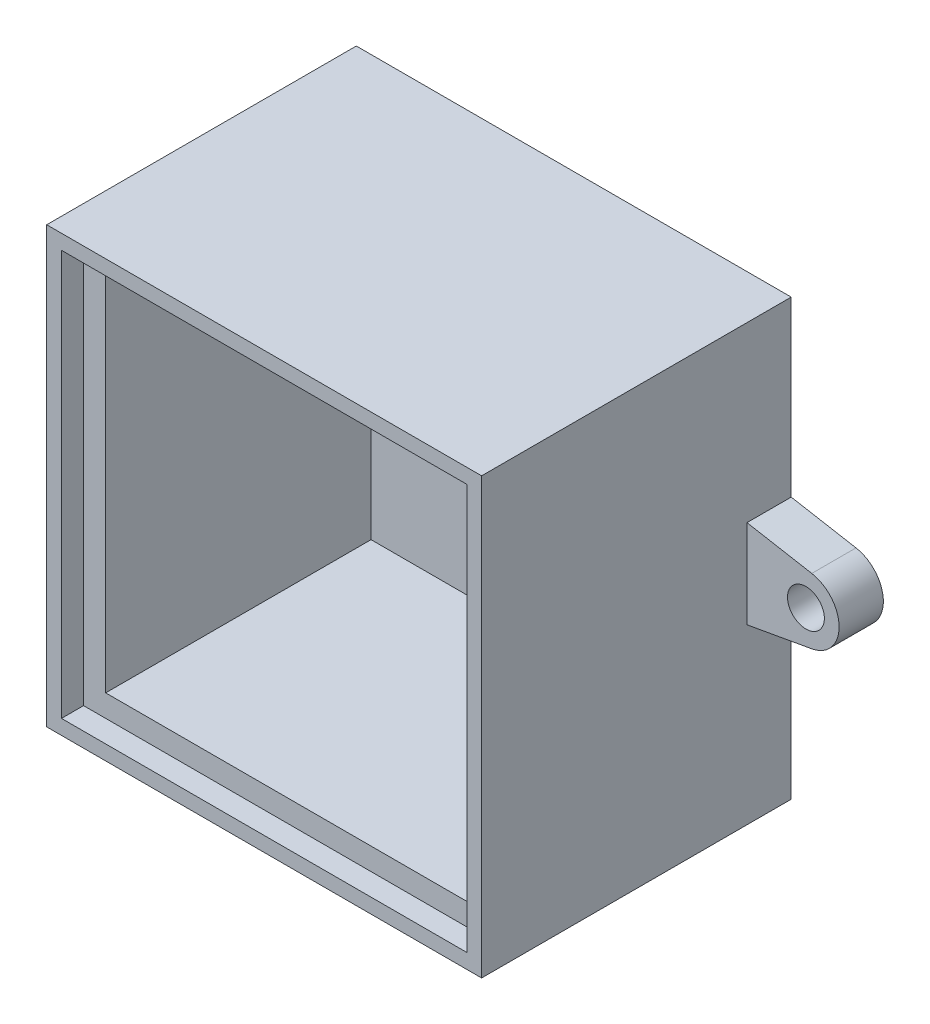
ISO-10303-21;
HEADER;
FILE_DESCRIPTION(('STEP AP214'),'2;1');
FILE_NAME('part.step','',(''),(''),'','','');
FILE_SCHEMA(('AUTOMOTIVE_DESIGN { 1 0 10303 214 1 1 1 1 }'));
ENDSEC;
DATA;
#1=APPLICATION_CONTEXT('core data for automotive mechanical design processes');
#2=APPLICATION_PROTOCOL_DEFINITION('international standard','automotive_design',2000,#1);
#3=PRODUCT_CONTEXT('',#1,'mechanical');
#4=PRODUCT('Part','Part','',(#3));
#5=PRODUCT_RELATED_PRODUCT_CATEGORY('part','',(#4));
#6=PRODUCT_DEFINITION_FORMATION('','',#4);
#7=PRODUCT_DEFINITION_CONTEXT('part definition',#1,'design');
#8=PRODUCT_DEFINITION('design','',#6,#7);
#9=PRODUCT_DEFINITION_SHAPE('','',#8);
#10=(LENGTH_UNIT() NAMED_UNIT(*) SI_UNIT(.MILLI.,.METRE.));
#11=(NAMED_UNIT(*) PLANE_ANGLE_UNIT() SI_UNIT($,.RADIAN.));
#12=(NAMED_UNIT(*) SI_UNIT($,.STERADIAN.) SOLID_ANGLE_UNIT());
#13=UNCERTAINTY_MEASURE_WITH_UNIT(LENGTH_MEASURE(1.E-05),#10,'distance_accuracy_value','');
#14=(GEOMETRIC_REPRESENTATION_CONTEXT(3) GLOBAL_UNCERTAINTY_ASSIGNED_CONTEXT((#13)) GLOBAL_UNIT_ASSIGNED_CONTEXT((#10,
#11,#12)) REPRESENTATION_CONTEXT('',''));
#15=CARTESIAN_POINT('',(0.,0.,0.));
#16=DIRECTION('',(0.,0.,1.));
#17=DIRECTION('',(1.,0.,0.));
#18=AXIS2_PLACEMENT_3D('',#15,#16,#17);
#19=CARTESIAN_POINT('',(0.,0.,36.));
#20=DIRECTION('',(0.,0.,1.));
#21=DIRECTION('',(1.,0.,0.));
#22=AXIS2_PLACEMENT_3D('',#19,#20,#21);
#23=PLANE('',#22);
#24=DIRECTION('',(0.,-1.,0.));
#25=VECTOR('',#24,1.);
#26=CARTESIAN_POINT('',(-27.5,-27.5,36.));
#27=LINE('',#26,#25);
#28=CARTESIAN_POINT('',(-27.5,27.5,36.));
#29=VERTEX_POINT('',#28);
#30=CARTESIAN_POINT('',(-27.5,-27.5,36.));
#31=VERTEX_POINT('',#30);
#32=EDGE_CURVE('E327',#29,#31,#27,.T.);
#33=ORIENTED_EDGE('',*,*,#32,.T.);
#34=DIRECTION('',(1.,0.,0.));
#35=VECTOR('',#34,1.);
#36=CARTESIAN_POINT('',(27.5,-27.5,36.));
#37=LINE('',#36,#35);
#38=CARTESIAN_POINT('',(27.5,-27.5,36.));
#39=VERTEX_POINT('',#38);
#40=EDGE_CURVE('E340',#31,#39,#37,.T.);
#41=ORIENTED_EDGE('',*,*,#40,.T.);
#42=DIRECTION('',(0.,1.,0.));
#43=VECTOR('',#42,1.);
#44=CARTESIAN_POINT('',(27.5,-27.5,36.));
#45=LINE('',#44,#43);
#46=CARTESIAN_POINT('',(27.5,27.5,36.));
#47=VERTEX_POINT('',#46);
#48=EDGE_CURVE('E342',#39,#47,#45,.T.);
#49=ORIENTED_EDGE('',*,*,#48,.T.);
#50=DIRECTION('',(-1.,0.,0.));
#51=VECTOR('',#50,1.);
#52=CARTESIAN_POINT('',(27.5,27.5,36.));
#53=LINE('',#52,#51);
#54=EDGE_CURVE('E331',#47,#29,#53,.T.);
#55=ORIENTED_EDGE('',*,*,#54,.T.);
#56=EDGE_LOOP('',(#33,#41,#49,#55));
#57=FACE_BOUND('',#56,.T.);
#58=DIRECTION('',(1.,0.,0.));
#59=VECTOR('',#58,1.);
#60=CARTESIAN_POINT('',(24.5,-24.5,36.));
#61=LINE('',#60,#59);
#62=CARTESIAN_POINT('',(-24.5,-24.5,36.));
#63=VERTEX_POINT('',#62);
#64=CARTESIAN_POINT('',(24.5,-24.5,36.));
#65=VERTEX_POINT('',#64);
#66=EDGE_CURVE('E371',#63,#65,#61,.T.);
#67=ORIENTED_EDGE('',*,*,#66,.F.);
#68=DIRECTION('',(0.,-1.,0.));
#69=VECTOR('',#68,1.);
#70=CARTESIAN_POINT('',(-24.5,-24.5,36.));
#71=LINE('',#70,#69);
#72=CARTESIAN_POINT('',(-24.5,24.5,36.));
#73=VERTEX_POINT('',#72);
#74=EDGE_CURVE('E369',#73,#63,#71,.T.);
#75=ORIENTED_EDGE('',*,*,#74,.F.);
#76=DIRECTION('',(-1.,0.,0.));
#77=VECTOR('',#76,1.);
#78=CARTESIAN_POINT('',(24.5,24.5,36.));
#79=LINE('',#78,#77);
#80=CARTESIAN_POINT('',(24.5,24.5,36.));
#81=VERTEX_POINT('',#80);
#82=EDGE_CURVE('E377',#81,#73,#79,.T.);
#83=ORIENTED_EDGE('',*,*,#82,.F.);
#84=DIRECTION('',(0.,1.,0.));
#85=VECTOR('',#84,1.);
#86=CARTESIAN_POINT('',(24.5,-24.5,36.));
#87=LINE('',#86,#85);
#88=EDGE_CURVE('E374',#65,#81,#87,.T.);
#89=ORIENTED_EDGE('',*,*,#88,.F.);
#90=EDGE_LOOP('',(#67,#75,#83,#89));
#91=FACE_BOUND('',#90,.T.);
#92=ADVANCED_FACE('F43',(#57,#91),#23,.T.);
#93=CARTESIAN_POINT('',(-29.5,-29.5,36.));
#94=DIRECTION('',(1.,0.,0.));
#95=DIRECTION('',(0.,0.,-1.));
#96=AXIS2_PLACEMENT_3D('',#93,#94,#95);
#97=PLANE('',#96);
#98=DIRECTION('',(0.,-1.,0.));
#99=VECTOR('',#98,1.);
#100=CARTESIAN_POINT('',(-29.5,0.,3.));
#101=LINE('',#100,#99);
#102=CARTESIAN_POINT('',(-29.5,6.,3.));
#103=VERTEX_POINT('',#102);
#104=CARTESIAN_POINT('',(-29.5,-6.,3.));
#105=VERTEX_POINT('',#104);
#106=EDGE_CURVE('E272',#103,#105,#101,.T.);
#107=ORIENTED_EDGE('',*,*,#106,.T.);
#108=DIRECTION('',(0.,0.,-1.));
#109=VECTOR('',#108,1.);
#110=CARTESIAN_POINT('',(-29.5,-6.,3.));
#111=LINE('',#110,#109);
#112=CARTESIAN_POINT('',(-29.5,-6.,-3.));
#113=VERTEX_POINT('',#112);
#114=EDGE_CURVE('E280',#105,#113,#111,.T.);
#115=ORIENTED_EDGE('',*,*,#114,.T.);
#116=DIRECTION('',(0.,1.,0.));
#117=VECTOR('',#116,1.);
#118=CARTESIAN_POINT('',(-29.5,29.5,-3.));
#119=LINE('',#118,#117);
#120=CARTESIAN_POINT('',(-29.5,-29.5,-3.));
#121=VERTEX_POINT('',#120);
#122=EDGE_CURVE('E324',#121,#113,#119,.T.);
#123=ORIENTED_EDGE('',*,*,#122,.F.);
#124=DIRECTION('',(0.,0.,-1.));
#125=VECTOR('',#124,1.);
#126=CARTESIAN_POINT('',(-29.5,-29.5,36.));
#127=LINE('',#126,#125);
#128=CARTESIAN_POINT('',(-29.5,-29.5,39.));
#129=VERTEX_POINT('',#128);
#130=EDGE_CURVE('E11',#129,#121,#127,.T.);
#131=ORIENTED_EDGE('',*,*,#130,.F.);
#132=DIRECTION('',(0.,-1.,0.));
#133=VECTOR('',#132,1.);
#134=CARTESIAN_POINT('',(-29.5,29.5,39.));
#135=LINE('',#134,#133);
#136=CARTESIAN_POINT('',(-29.5,29.5,39.));
#137=VERTEX_POINT('',#136);
#138=EDGE_CURVE('E356',#137,#129,#135,.T.);
#139=ORIENTED_EDGE('',*,*,#138,.F.);
#140=DIRECTION('',(0.,0.,-1.));
#141=VECTOR('',#140,1.);
#142=CARTESIAN_POINT('',(-29.5,29.5,36.));
#143=LINE('',#142,#141);
#144=CARTESIAN_POINT('',(-29.5,29.5,-3.));
#145=VERTEX_POINT('',#144);
#146=EDGE_CURVE('E398',#137,#145,#143,.T.);
#147=ORIENTED_EDGE('',*,*,#146,.T.);
#148=CARTESIAN_POINT('',(-29.5,6.,-3.));
#149=VERTEX_POINT('',#148);
#150=EDGE_CURVE('E323',#149,#145,#119,.T.);
#151=ORIENTED_EDGE('',*,*,#150,.F.);
#152=DIRECTION('',(0.,0.,-1.));
#153=VECTOR('',#152,1.);
#154=CARTESIAN_POINT('',(-29.5,6.,3.));
#155=LINE('',#154,#153);
#156=EDGE_CURVE('E278',#103,#149,#155,.T.);
#157=ORIENTED_EDGE('',*,*,#156,.F.);
#158=EDGE_LOOP('',(#107,#115,#123,#131,#139,#147,#151,#157));
#159=FACE_BOUND('',#158,.T.);
#160=ADVANCED_FACE('F45',(#159),#97,.F.);
#161=CARTESIAN_POINT('',(29.5,-29.5,36.));
#162=DIRECTION('',(0.,1.,0.));
#163=DIRECTION('',(0.,0.,1.));
#164=AXIS2_PLACEMENT_3D('',#161,#162,#163);
#165=PLANE('',#164);
#166=ORIENTED_EDGE('',*,*,#130,.T.);
#167=DIRECTION('',(-1.,0.,0.));
#168=VECTOR('',#167,1.);
#169=CARTESIAN_POINT('',(-29.5,-29.5,-3.));
#170=LINE('',#169,#168);
#171=CARTESIAN_POINT('',(29.5,-29.5,-3.));
#172=VERTEX_POINT('',#171);
#173=EDGE_CURVE('E320',#172,#121,#170,.T.);
#174=ORIENTED_EDGE('',*,*,#173,.F.);
#175=DIRECTION('',(0.,0.,-1.));
#176=VECTOR('',#175,1.);
#177=CARTESIAN_POINT('',(29.5,-29.5,36.));
#178=LINE('',#177,#176);
#179=CARTESIAN_POINT('',(29.5,-29.5,39.));
#180=VERTEX_POINT('',#179);
#181=EDGE_CURVE('E51',#180,#172,#178,.T.);
#182=ORIENTED_EDGE('',*,*,#181,.F.);
#183=DIRECTION('',(1.,0.,0.));
#184=VECTOR('',#183,1.);
#185=CARTESIAN_POINT('',(-29.5,-29.5,39.));
#186=LINE('',#185,#184);
#187=EDGE_CURVE('E359',#129,#180,#186,.T.);
#188=ORIENTED_EDGE('',*,*,#187,.F.);
#189=EDGE_LOOP('',(#166,#174,#182,#188));
#190=FACE_BOUND('',#189,.T.);
#191=ADVANCED_FACE('F408',(#190),#165,.F.);
#192=CARTESIAN_POINT('',(29.5,-29.5,36.));
#193=DIRECTION('',(-1.,0.,0.));
#194=DIRECTION('',(0.,0.,1.));
#195=AXIS2_PLACEMENT_3D('',#192,#193,#194);
#196=PLANE('',#195);
#197=DIRECTION('',(0.,-1.,0.));
#198=VECTOR('',#197,1.);
#199=CARTESIAN_POINT('',(29.5,0.,3.));
#200=LINE('',#199,#198);
#201=CARTESIAN_POINT('',(29.5,6.,3.));
#202=VERTEX_POINT('',#201);
#203=CARTESIAN_POINT('',(29.5,-6.,3.));
#204=VERTEX_POINT('',#203);
#205=EDGE_CURVE('E66',#202,#204,#200,.T.);
#206=ORIENTED_EDGE('',*,*,#205,.F.);
#207=DIRECTION('',(0.,0.,-1.));
#208=VECTOR('',#207,1.);
#209=CARTESIAN_POINT('',(29.5,6.,3.));
#210=LINE('',#209,#208);
#211=CARTESIAN_POINT('',(29.5,6.,-3.));
#212=VERTEX_POINT('',#211);
#213=EDGE_CURVE('E215',#202,#212,#210,.T.);
#214=ORIENTED_EDGE('',*,*,#213,.T.);
#215=DIRECTION('',(0.,-1.,0.));
#216=VECTOR('',#215,1.);
#217=CARTESIAN_POINT('',(29.5,-29.5,-3.));
#218=LINE('',#217,#216);
#219=CARTESIAN_POINT('',(29.5,29.5,-3.));
#220=VERTEX_POINT('',#219);
#221=EDGE_CURVE('E227',#220,#212,#218,.T.);
#222=ORIENTED_EDGE('',*,*,#221,.F.);
#223=DIRECTION('',(0.,0.,-1.));
#224=VECTOR('',#223,1.);
#225=CARTESIAN_POINT('',(29.5,29.5,36.));
#226=LINE('',#225,#224);
#227=CARTESIAN_POINT('',(29.5,29.5,39.));
#228=VERTEX_POINT('',#227);
#229=EDGE_CURVE('E401',#228,#220,#226,.T.);
#230=ORIENTED_EDGE('',*,*,#229,.F.);
#231=DIRECTION('',(0.,1.,0.));
#232=VECTOR('',#231,1.);
#233=CARTESIAN_POINT('',(29.5,-29.5,39.));
#234=LINE('',#233,#232);
#235=EDGE_CURVE('E362',#180,#228,#234,.T.);
#236=ORIENTED_EDGE('',*,*,#235,.F.);
#237=ORIENTED_EDGE('',*,*,#181,.T.);
#238=CARTESIAN_POINT('',(29.5,-6.,-3.));
#239=VERTEX_POINT('',#238);
#240=EDGE_CURVE('E318',#239,#172,#218,.T.);
#241=ORIENTED_EDGE('',*,*,#240,.F.);
#242=DIRECTION('',(0.,0.,-1.));
#243=VECTOR('',#242,1.);
#244=CARTESIAN_POINT('',(29.5,-6.,3.));
#245=LINE('',#244,#243);
#246=EDGE_CURVE('E249',#204,#239,#245,.T.);
#247=ORIENTED_EDGE('',*,*,#246,.F.);
#248=EDGE_LOOP('',(#206,#214,#222,#230,#236,#237,#241,#247));
#249=FACE_BOUND('',#248,.T.);
#250=ADVANCED_FACE('F405',(#249),#196,.F.);
#251=CARTESIAN_POINT('',(29.5,29.5,36.));
#252=DIRECTION('',(0.,-1.,0.));
#253=DIRECTION('',(0.,0.,-1.));
#254=AXIS2_PLACEMENT_3D('',#251,#252,#253);
#255=PLANE('',#254);
#256=ORIENTED_EDGE('',*,*,#229,.T.);
#257=DIRECTION('',(1.,0.,0.));
#258=VECTOR('',#257,1.);
#259=CARTESIAN_POINT('',(29.5,29.5,-3.));
#260=LINE('',#259,#258);
#261=EDGE_CURVE('E316',#145,#220,#260,.T.);
#262=ORIENTED_EDGE('',*,*,#261,.F.);
#263=ORIENTED_EDGE('',*,*,#146,.F.);
#264=DIRECTION('',(-1.,0.,0.));
#265=VECTOR('',#264,1.);
#266=CARTESIAN_POINT('',(29.5,29.5,39.));
#267=LINE('',#266,#265);
#268=EDGE_CURVE('E365',#228,#137,#267,.T.);
#269=ORIENTED_EDGE('',*,*,#268,.F.);
#270=EDGE_LOOP('',(#256,#262,#263,#269));
#271=FACE_BOUND('',#270,.T.);
#272=ADVANCED_FACE('F427',(#271),#255,.F.);
#273=CARTESIAN_POINT('',(-24.5,-24.5,36.));
#274=DIRECTION('',(1.,0.,0.));
#275=DIRECTION('',(0.,0.,-1.));
#276=AXIS2_PLACEMENT_3D('',#273,#274,#275);
#277=PLANE('',#276);
#278=DIRECTION('',(0.,-1.,0.));
#279=VECTOR('',#278,1.);
#280=CARTESIAN_POINT('',(-24.5,-24.5,0.));
#281=LINE('',#280,#279);
#282=CARTESIAN_POINT('',(-24.5,24.5,0.));
#283=VERTEX_POINT('',#282);
#284=CARTESIAN_POINT('',(-24.5,-24.5,0.));
#285=VERTEX_POINT('',#284);
#286=EDGE_CURVE('E368',#283,#285,#281,.T.);
#287=ORIENTED_EDGE('',*,*,#286,.F.);
#288=DIRECTION('',(0.,0.,-1.));
#289=VECTOR('',#288,1.);
#290=CARTESIAN_POINT('',(-24.5,24.5,36.));
#291=LINE('',#290,#289);
#292=EDGE_CURVE('E379',#73,#283,#291,.T.);
#293=ORIENTED_EDGE('',*,*,#292,.F.);
#294=ORIENTED_EDGE('',*,*,#74,.T.);
#295=DIRECTION('',(0.,0.,-1.));
#296=VECTOR('',#295,1.);
#297=CARTESIAN_POINT('',(-24.5,-24.5,36.));
#298=LINE('',#297,#296);
#299=EDGE_CURVE('E395',#63,#285,#298,.T.);
#300=ORIENTED_EDGE('',*,*,#299,.T.);
#301=EDGE_LOOP('',(#287,#293,#294,#300));
#302=FACE_BOUND('',#301,.T.);
#303=ADVANCED_FACE('F458',(#302),#277,.T.);
#304=CARTESIAN_POINT('',(24.5,-24.5,36.));
#305=DIRECTION('',(0.,1.,0.));
#306=DIRECTION('',(0.,0.,1.));
#307=AXIS2_PLACEMENT_3D('',#304,#305,#306);
#308=PLANE('',#307);
#309=DIRECTION('',(1.,0.,0.));
#310=VECTOR('',#309,1.);
#311=CARTESIAN_POINT('',(24.5,-24.5,0.));
#312=LINE('',#311,#310);
#313=CARTESIAN_POINT('',(24.5,-24.5,0.));
#314=VERTEX_POINT('',#313);
#315=EDGE_CURVE('E382',#285,#314,#312,.T.);
#316=ORIENTED_EDGE('',*,*,#315,.F.);
#317=ORIENTED_EDGE('',*,*,#299,.F.);
#318=ORIENTED_EDGE('',*,*,#66,.T.);
#319=DIRECTION('',(0.,0.,-1.));
#320=VECTOR('',#319,1.);
#321=CARTESIAN_POINT('',(24.5,-24.5,36.));
#322=LINE('',#321,#320);
#323=EDGE_CURVE('E393',#65,#314,#322,.T.);
#324=ORIENTED_EDGE('',*,*,#323,.T.);
#325=EDGE_LOOP('',(#316,#317,#318,#324));
#326=FACE_BOUND('',#325,.T.);
#327=ADVANCED_FACE('F499',(#326),#308,.T.);
#328=CARTESIAN_POINT('',(24.5,-24.5,36.));
#329=DIRECTION('',(-1.,0.,0.));
#330=DIRECTION('',(0.,0.,1.));
#331=AXIS2_PLACEMENT_3D('',#328,#329,#330);
#332=PLANE('',#331);
#333=DIRECTION('',(0.,1.,0.));
#334=VECTOR('',#333,1.);
#335=CARTESIAN_POINT('',(24.5,-24.5,0.));
#336=LINE('',#335,#334);
#337=CARTESIAN_POINT('',(24.5,24.5,0.));
#338=VERTEX_POINT('',#337);
#339=EDGE_CURVE('E385',#314,#338,#336,.T.);
#340=ORIENTED_EDGE('',*,*,#339,.F.);
#341=ORIENTED_EDGE('',*,*,#323,.F.);
#342=ORIENTED_EDGE('',*,*,#88,.T.);
#343=DIRECTION('',(0.,0.,-1.));
#344=VECTOR('',#343,1.);
#345=CARTESIAN_POINT('',(24.5,24.5,36.));
#346=LINE('',#345,#344);
#347=EDGE_CURVE('E391',#81,#338,#346,.T.);
#348=ORIENTED_EDGE('',*,*,#347,.T.);
#349=EDGE_LOOP('',(#340,#341,#342,#348));
#350=FACE_BOUND('',#349,.T.);
#351=ADVANCED_FACE('F507',(#350),#332,.T.);
#352=CARTESIAN_POINT('',(24.5,24.5,36.));
#353=DIRECTION('',(0.,-1.,0.));
#354=DIRECTION('',(0.,0.,-1.));
#355=AXIS2_PLACEMENT_3D('',#352,#353,#354);
#356=PLANE('',#355);
#357=DIRECTION('',(-1.,0.,0.));
#358=VECTOR('',#357,1.);
#359=CARTESIAN_POINT('',(24.5,24.5,0.));
#360=LINE('',#359,#358);
#361=EDGE_CURVE('E372',#338,#283,#360,.T.);
#362=ORIENTED_EDGE('',*,*,#361,.F.);
#363=ORIENTED_EDGE('',*,*,#347,.F.);
#364=ORIENTED_EDGE('',*,*,#82,.T.);
#365=ORIENTED_EDGE('',*,*,#292,.T.);
#366=EDGE_LOOP('',(#362,#363,#364,#365));
#367=FACE_BOUND('',#366,.T.);
#368=ADVANCED_FACE('F515',(#367),#356,.T.);
#369=CARTESIAN_POINT('',(0.,0.,39.));
#370=DIRECTION('',(0.,0.,1.));
#371=DIRECTION('',(1.,0.,0.));
#372=AXIS2_PLACEMENT_3D('',#369,#370,#371);
#373=PLANE('',#372);
#374=ORIENTED_EDGE('',*,*,#138,.T.);
#375=ORIENTED_EDGE('',*,*,#187,.T.);
#376=ORIENTED_EDGE('',*,*,#235,.T.);
#377=ORIENTED_EDGE('',*,*,#268,.T.);
#378=EDGE_LOOP('',(#374,#375,#376,#377));
#379=FACE_BOUND('',#378,.T.);
#380=DIRECTION('',(1.,0.,0.));
#381=VECTOR('',#380,1.);
#382=CARTESIAN_POINT('',(27.5,-27.5,39.));
#383=LINE('',#382,#381);
#384=CARTESIAN_POINT('',(-27.5,-27.5,39.));
#385=VERTEX_POINT('',#384);
#386=CARTESIAN_POINT('',(27.5,-27.5,39.));
#387=VERTEX_POINT('',#386);
#388=EDGE_CURVE('E330',#385,#387,#383,.T.);
#389=ORIENTED_EDGE('',*,*,#388,.F.);
#390=DIRECTION('',(0.,-1.,0.));
#391=VECTOR('',#390,1.);
#392=CARTESIAN_POINT('',(-27.5,-27.5,39.));
#393=LINE('',#392,#391);
#394=CARTESIAN_POINT('',(-27.5,27.5,39.));
#395=VERTEX_POINT('',#394);
#396=EDGE_CURVE('E328',#395,#385,#393,.T.);
#397=ORIENTED_EDGE('',*,*,#396,.F.);
#398=DIRECTION('',(-1.,0.,0.));
#399=VECTOR('',#398,1.);
#400=CARTESIAN_POINT('',(27.5,27.5,39.));
#401=LINE('',#400,#399);
#402=CARTESIAN_POINT('',(27.5,27.5,39.));
#403=VERTEX_POINT('',#402);
#404=EDGE_CURVE('E336',#403,#395,#401,.T.);
#405=ORIENTED_EDGE('',*,*,#404,.F.);
#406=DIRECTION('',(0.,1.,0.));
#407=VECTOR('',#406,1.);
#408=CARTESIAN_POINT('',(27.5,-27.5,39.));
#409=LINE('',#408,#407);
#410=EDGE_CURVE('E333',#387,#403,#409,.T.);
#411=ORIENTED_EDGE('',*,*,#410,.F.);
#412=EDGE_LOOP('',(#389,#397,#405,#411));
#413=FACE_BOUND('',#412,.T.);
#414=ADVANCED_FACE('F524',(#379,#413),#373,.T.);
#415=CARTESIAN_POINT('',(-27.5,-27.5,39.));
#416=DIRECTION('',(1.,0.,0.));
#417=DIRECTION('',(0.,0.,-1.));
#418=AXIS2_PLACEMENT_3D('',#415,#416,#417);
#419=PLANE('',#418);
#420=ORIENTED_EDGE('',*,*,#32,.F.);
#421=DIRECTION('',(0.,0.,-1.));
#422=VECTOR('',#421,1.);
#423=CARTESIAN_POINT('',(-27.5,27.5,39.));
#424=LINE('',#423,#422);
#425=EDGE_CURVE('E338',#395,#29,#424,.T.);
#426=ORIENTED_EDGE('',*,*,#425,.F.);
#427=ORIENTED_EDGE('',*,*,#396,.T.);
#428=DIRECTION('',(0.,0.,-1.));
#429=VECTOR('',#428,1.);
#430=CARTESIAN_POINT('',(-27.5,-27.5,39.));
#431=LINE('',#430,#429);
#432=EDGE_CURVE('E353',#385,#31,#431,.T.);
#433=ORIENTED_EDGE('',*,*,#432,.T.);
#434=EDGE_LOOP('',(#420,#426,#427,#433));
#435=FACE_BOUND('',#434,.T.);
#436=ADVANCED_FACE('F534',(#435),#419,.T.);
#437=CARTESIAN_POINT('',(27.5,-27.5,39.));
#438=DIRECTION('',(0.,1.,0.));
#439=DIRECTION('',(0.,0.,1.));
#440=AXIS2_PLACEMENT_3D('',#437,#438,#439);
#441=PLANE('',#440);
#442=ORIENTED_EDGE('',*,*,#40,.F.);
#443=ORIENTED_EDGE('',*,*,#432,.F.);
#444=ORIENTED_EDGE('',*,*,#388,.T.);
#445=DIRECTION('',(0.,0.,-1.));
#446=VECTOR('',#445,1.);
#447=CARTESIAN_POINT('',(27.5,-27.5,39.));
#448=LINE('',#447,#446);
#449=EDGE_CURVE('E350',#387,#39,#448,.T.);
#450=ORIENTED_EDGE('',*,*,#449,.T.);
#451=EDGE_LOOP('',(#442,#443,#444,#450));
#452=FACE_BOUND('',#451,.T.);
#453=ADVANCED_FACE('F543',(#452),#441,.T.);
#454=CARTESIAN_POINT('',(27.5,-27.5,39.));
#455=DIRECTION('',(-1.,0.,0.));
#456=DIRECTION('',(0.,0.,1.));
#457=AXIS2_PLACEMENT_3D('',#454,#455,#456);
#458=PLANE('',#457);
#459=ORIENTED_EDGE('',*,*,#48,.F.);
#460=ORIENTED_EDGE('',*,*,#449,.F.);
#461=ORIENTED_EDGE('',*,*,#410,.T.);
#462=DIRECTION('',(0.,0.,-1.));
#463=VECTOR('',#462,1.);
#464=CARTESIAN_POINT('',(27.5,27.5,39.));
#465=LINE('',#464,#463);
#466=EDGE_CURVE('E347',#403,#47,#465,.T.);
#467=ORIENTED_EDGE('',*,*,#466,.T.);
#468=EDGE_LOOP('',(#459,#460,#461,#467));
#469=FACE_BOUND('',#468,.T.);
#470=ADVANCED_FACE('F552',(#469),#458,.T.);
#471=CARTESIAN_POINT('',(27.5,27.5,39.));
#472=DIRECTION('',(0.,-1.,0.));
#473=DIRECTION('',(0.,0.,-1.));
#474=AXIS2_PLACEMENT_3D('',#471,#472,#473);
#475=PLANE('',#474);
#476=ORIENTED_EDGE('',*,*,#54,.F.);
#477=ORIENTED_EDGE('',*,*,#466,.F.);
#478=ORIENTED_EDGE('',*,*,#404,.T.);
#479=ORIENTED_EDGE('',*,*,#425,.T.);
#480=EDGE_LOOP('',(#476,#477,#478,#479));
#481=FACE_BOUND('',#480,.T.);
#482=ADVANCED_FACE('F561',(#481),#475,.T.);
#483=CARTESIAN_POINT('',(0.,0.,-3.));
#484=DIRECTION('',(0.,0.,1.));
#485=DIRECTION('',(1.,0.,0.));
#486=AXIS2_PLACEMENT_3D('',#483,#484,#485);
#487=PLANE('',#486);
#488=ORIENTED_EDGE('',*,*,#261,.T.);
#489=ORIENTED_EDGE('',*,*,#221,.T.);
#490=DIRECTION('',(-0.98442284397967,0.175817132984753,0.));
#491=VECTOR('',#490,1.);
#492=CARTESIAN_POINT('',(1.95036450784307,10.9203428756536,-3.));
#493=LINE('',#492,#491);
#494=CARTESIAN_POINT('',(38.2911770984314,4.42990279790852,-3.));
#495=VERTEX_POINT('',#494);
#496=EDGE_CURVE('E209',#495,#212,#493,.T.);
#497=ORIENTED_EDGE('',*,*,#496,.F.);
#498=CARTESIAN_POINT('',(37.5,0.,-3.));
#499=DIRECTION('',(0.,0.,1.));
#500=DIRECTION('',(1.,0.,0.));
#501=AXIS2_PLACEMENT_3D('',#498,#499,#500);
#502=CIRCLE('',#501,4.5);
#503=CARTESIAN_POINT('',(38.2911770984314,-4.42990279790852,-3.));
#504=VERTEX_POINT('',#503);
#505=EDGE_CURVE('E224',#495,#504,#502,.F.);
#506=ORIENTED_EDGE('',*,*,#505,.T.);
#507=DIRECTION('',(-0.98442284397967,-0.175817132984753,0.));
#508=VECTOR('',#507,1.);
#509=CARTESIAN_POINT('',(1.95036450784307,-10.9203428756536,-3.));
#510=LINE('',#509,#508);
#511=EDGE_CURVE('E228',#504,#239,#510,.T.);
#512=ORIENTED_EDGE('',*,*,#511,.T.);
#513=ORIENTED_EDGE('',*,*,#240,.T.);
#514=ORIENTED_EDGE('',*,*,#173,.T.);
#515=ORIENTED_EDGE('',*,*,#122,.T.);
#516=DIRECTION('',(0.98442284397967,-0.175817132984753,0.));
#517=VECTOR('',#516,1.);
#518=CARTESIAN_POINT('',(-1.95036450784307,-10.9203428756536,-3.));
#519=LINE('',#518,#517);
#520=CARTESIAN_POINT('',(-38.2911770984314,-4.42990279790852,-3.));
#521=VERTEX_POINT('',#520);
#522=EDGE_CURVE('E260',#521,#113,#519,.T.);
#523=ORIENTED_EDGE('',*,*,#522,.F.);
#524=CARTESIAN_POINT('',(-37.5,0.,-3.));
#525=DIRECTION('',(0.,0.,1.));
#526=DIRECTION('',(1.,0.,0.));
#527=AXIS2_PLACEMENT_3D('',#524,#525,#526);
#528=CIRCLE('',#527,4.5);
#529=CARTESIAN_POINT('',(-38.2911770984314,4.42990279790852,-3.));
#530=VERTEX_POINT('',#529);
#531=EDGE_CURVE('E259',#530,#521,#528,.T.);
#532=ORIENTED_EDGE('',*,*,#531,.F.);
#533=DIRECTION('',(0.98442284397967,0.175817132984753,0.));
#534=VECTOR('',#533,1.);
#535=CARTESIAN_POINT('',(-1.95036450784307,10.9203428756536,-3.));
#536=LINE('',#535,#534);
#537=EDGE_CURVE('E255',#530,#149,#536,.T.);
#538=ORIENTED_EDGE('',*,*,#537,.T.);
#539=ORIENTED_EDGE('',*,*,#150,.T.);
#540=EDGE_LOOP('',(#488,#489,#497,#506,#512,#513,#514,#515,#523,#532,#538,#539));
#541=FACE_BOUND('',#540,.T.);
#542=DIRECTION('',(0.,-1.,0.));
#543=VECTOR('',#542,1.);
#544=CARTESIAN_POINT('',(4.50000000000001,-23.5,-3.));
#545=LINE('',#544,#543);
#546=CARTESIAN_POINT('',(4.50000000000001,-15.5,-3.));
#547=VERTEX_POINT('',#546);
#548=CARTESIAN_POINT('',(4.50000000000001,-23.5,-3.));
#549=VERTEX_POINT('',#548);
#550=EDGE_CURVE('E286',#547,#549,#545,.T.);
#551=ORIENTED_EDGE('',*,*,#550,.F.);
#552=DIRECTION('',(1.,0.,0.));
#553=VECTOR('',#552,1.);
#554=CARTESIAN_POINT('',(-8.49999999999999,-15.5,-3.));
#555=LINE('',#554,#553);
#556=CARTESIAN_POINT('',(-8.49999999999999,-15.5,-3.));
#557=VERTEX_POINT('',#556);
#558=EDGE_CURVE('E294',#557,#547,#555,.T.);
#559=ORIENTED_EDGE('',*,*,#558,.F.);
#560=DIRECTION('',(0.,1.,0.));
#561=VECTOR('',#560,1.);
#562=CARTESIAN_POINT('',(-8.49999999999999,-23.5,-3.));
#563=LINE('',#562,#561);
#564=CARTESIAN_POINT('',(-8.49999999999999,-23.5,-3.));
#565=VERTEX_POINT('',#564);
#566=EDGE_CURVE('E291',#565,#557,#563,.T.);
#567=ORIENTED_EDGE('',*,*,#566,.F.);
#568=DIRECTION('',(-1.,0.,0.));
#569=VECTOR('',#568,1.);
#570=CARTESIAN_POINT('',(-8.49999999999999,-23.5,-3.));
#571=LINE('',#570,#569);
#572=EDGE_CURVE('E288',#549,#565,#571,.T.);
#573=ORIENTED_EDGE('',*,*,#572,.F.);
#574=EDGE_LOOP('',(#551,#559,#567,#573));
#575=FACE_BOUND('',#574,.T.);
#576=CARTESIAN_POINT('',(37.5,0.,-3.));
#577=DIRECTION('',(0.,0.,1.));
#578=DIRECTION('',(1.,0.,0.));
#579=AXIS2_PLACEMENT_3D('',#576,#577,#578);
#580=CIRCLE('',#579,2.5);
#581=CARTESIAN_POINT('',(40.,0.,-3.));
#582=VERTEX_POINT('',#581);
#583=EDGE_CURVE('E233',#582,#582,#580,.F.);
#584=ORIENTED_EDGE('',*,*,#583,.F.);
#585=EDGE_LOOP('',(#584));
#586=FACE_BOUND('',#585,.T.);
#587=CARTESIAN_POINT('',(-37.5,0.,-3.));
#588=DIRECTION('',(0.,0.,1.));
#589=DIRECTION('',(1.,0.,0.));
#590=AXIS2_PLACEMENT_3D('',#587,#588,#589);
#591=CIRCLE('',#590,2.5);
#592=CARTESIAN_POINT('',(-35.,0.,-3.));
#593=VERTEX_POINT('',#592);
#594=EDGE_CURVE('E258',#593,#593,#591,.T.);
#595=ORIENTED_EDGE('',*,*,#594,.T.);
#596=EDGE_LOOP('',(#595));
#597=FACE_BOUND('',#596,.T.);
#598=ADVANCED_FACE('F221',(#541,#575,#586,#597),#487,.F.);
#599=CARTESIAN_POINT('',(0.,0.,0.));
#600=DIRECTION('',(0.,0.,1.));
#601=DIRECTION('',(1.,0.,0.));
#602=AXIS2_PLACEMENT_3D('',#599,#600,#601);
#603=PLANE('',#602);
#604=ORIENTED_EDGE('',*,*,#361,.T.);
#605=ORIENTED_EDGE('',*,*,#286,.T.);
#606=ORIENTED_EDGE('',*,*,#315,.T.);
#607=ORIENTED_EDGE('',*,*,#339,.T.);
#608=EDGE_LOOP('',(#604,#605,#606,#607));
#609=FACE_BOUND('',#608,.T.);
#610=DIRECTION('',(1.,0.,0.));
#611=VECTOR('',#610,1.);
#612=CARTESIAN_POINT('',(-8.49999999999999,-15.5,0.));
#613=LINE('',#612,#611);
#614=CARTESIAN_POINT('',(-8.49999999999999,-15.5,0.));
#615=VERTEX_POINT('',#614);
#616=CARTESIAN_POINT('',(4.50000000000001,-15.5,0.));
#617=VERTEX_POINT('',#616);
#618=EDGE_CURVE('E289',#615,#617,#613,.T.);
#619=ORIENTED_EDGE('',*,*,#618,.T.);
#620=DIRECTION('',(0.,-1.,0.));
#621=VECTOR('',#620,1.);
#622=CARTESIAN_POINT('',(4.50000000000001,-23.5,0.));
#623=LINE('',#622,#621);
#624=CARTESIAN_POINT('',(4.50000000000001,-23.5,0.));
#625=VERTEX_POINT('',#624);
#626=EDGE_CURVE('E254',#617,#625,#623,.T.);
#627=ORIENTED_EDGE('',*,*,#626,.T.);
#628=DIRECTION('',(-1.,0.,0.));
#629=VECTOR('',#628,1.);
#630=CARTESIAN_POINT('',(-8.49999999999999,-23.5,0.));
#631=LINE('',#630,#629);
#632=CARTESIAN_POINT('',(-8.49999999999999,-23.5,0.));
#633=VERTEX_POINT('',#632);
#634=EDGE_CURVE('E299',#625,#633,#631,.T.);
#635=ORIENTED_EDGE('',*,*,#634,.T.);
#636=DIRECTION('',(0.,1.,0.));
#637=VECTOR('',#636,1.);
#638=CARTESIAN_POINT('',(-8.49999999999999,-23.5,0.));
#639=LINE('',#638,#637);
#640=EDGE_CURVE('E302',#633,#615,#639,.T.);
#641=ORIENTED_EDGE('',*,*,#640,.T.);
#642=EDGE_LOOP('',(#619,#627,#635,#641));
#643=FACE_BOUND('',#642,.T.);
#644=ADVANCED_FACE('F580',(#609,#643),#603,.T.);
#645=CARTESIAN_POINT('',(4.50000000000001,-23.5,-3.));
#646=DIRECTION('',(-1.,0.,0.));
#647=DIRECTION('',(0.,0.,1.));
#648=AXIS2_PLACEMENT_3D('',#645,#646,#647);
#649=PLANE('',#648);
#650=ORIENTED_EDGE('',*,*,#626,.F.);
#651=DIRECTION('',(0.,0.,1.));
#652=VECTOR('',#651,1.);
#653=CARTESIAN_POINT('',(4.50000000000001,-15.5,-3.));
#654=LINE('',#653,#652);
#655=EDGE_CURVE('E296',#547,#617,#654,.T.);
#656=ORIENTED_EDGE('',*,*,#655,.F.);
#657=ORIENTED_EDGE('',*,*,#550,.T.);
#658=DIRECTION('',(0.,0.,1.));
#659=VECTOR('',#658,1.);
#660=CARTESIAN_POINT('',(4.50000000000001,-23.5,-3.));
#661=LINE('',#660,#659);
#662=EDGE_CURVE('E313',#549,#625,#661,.T.);
#663=ORIENTED_EDGE('',*,*,#662,.T.);
#664=EDGE_LOOP('',(#650,#656,#657,#663));
#665=FACE_BOUND('',#664,.T.);
#666=ADVANCED_FACE('F594',(#665),#649,.T.);
#667=CARTESIAN_POINT('',(-8.49999999999999,-23.5,-3.));
#668=DIRECTION('',(0.,1.,0.));
#669=DIRECTION('',(0.,0.,1.));
#670=AXIS2_PLACEMENT_3D('',#667,#668,#669);
#671=PLANE('',#670);
#672=ORIENTED_EDGE('',*,*,#634,.F.);
#673=ORIENTED_EDGE('',*,*,#662,.F.);
#674=ORIENTED_EDGE('',*,*,#572,.T.);
#675=DIRECTION('',(0.,0.,1.));
#676=VECTOR('',#675,1.);
#677=CARTESIAN_POINT('',(-8.49999999999999,-23.5,-3.));
#678=LINE('',#677,#676);
#679=EDGE_CURVE('E311',#565,#633,#678,.T.);
#680=ORIENTED_EDGE('',*,*,#679,.T.);
#681=EDGE_LOOP('',(#672,#673,#674,#680));
#682=FACE_BOUND('',#681,.T.);
#683=ADVANCED_FACE('F603',(#682),#671,.T.);
#684=CARTESIAN_POINT('',(-8.49999999999999,-23.5,-3.));
#685=DIRECTION('',(1.,0.,0.));
#686=DIRECTION('',(0.,1.,0.));
#687=AXIS2_PLACEMENT_3D('',#684,#685,#686);
#688=PLANE('',#687);
#689=ORIENTED_EDGE('',*,*,#640,.F.);
#690=ORIENTED_EDGE('',*,*,#679,.F.);
#691=ORIENTED_EDGE('',*,*,#566,.T.);
#692=DIRECTION('',(0.,0.,1.));
#693=VECTOR('',#692,1.);
#694=CARTESIAN_POINT('',(-8.49999999999999,-15.5,-3.));
#695=LINE('',#694,#693);
#696=EDGE_CURVE('E309',#557,#615,#695,.T.);
#697=ORIENTED_EDGE('',*,*,#696,.T.);
#698=EDGE_LOOP('',(#689,#690,#691,#697));
#699=FACE_BOUND('',#698,.T.);
#700=ADVANCED_FACE('F443',(#699),#688,.T.);
#701=CARTESIAN_POINT('',(-8.49999999999999,-15.5,-3.));
#702=DIRECTION('',(0.,-1.,0.));
#703=DIRECTION('',(1.,0.,0.));
#704=AXIS2_PLACEMENT_3D('',#701,#702,#703);
#705=PLANE('',#704);
#706=ORIENTED_EDGE('',*,*,#618,.F.);
#707=ORIENTED_EDGE('',*,*,#696,.F.);
#708=ORIENTED_EDGE('',*,*,#558,.T.);
#709=ORIENTED_EDGE('',*,*,#655,.T.);
#710=EDGE_LOOP('',(#706,#707,#708,#709));
#711=FACE_BOUND('',#710,.T.);
#712=ADVANCED_FACE('F435',(#711),#705,.T.);
#713=CARTESIAN_POINT('',(1.95036450784307,-10.9203428756536,3.));
#714=DIRECTION('',(-0.175817132984753,0.98442284397967,0.));
#715=DIRECTION('',(-0.98442284397967,-0.175817132984753,0.));
#716=AXIS2_PLACEMENT_3D('',#713,#714,#715);
#717=PLANE('',#716);
#718=ORIENTED_EDGE('',*,*,#246,.T.);
#719=ORIENTED_EDGE('',*,*,#511,.F.);
#720=DIRECTION('',(0.,0.,-1.));
#721=VECTOR('',#720,1.);
#722=CARTESIAN_POINT('',(38.2911770984314,-4.42990279790852,3.));
#723=LINE('',#722,#721);
#724=CARTESIAN_POINT('',(38.2911770984314,-4.42990279790852,3.));
#725=VERTEX_POINT('',#724);
#726=EDGE_CURVE('E214',#725,#504,#723,.T.);
#727=ORIENTED_EDGE('',*,*,#726,.F.);
#728=DIRECTION('',(0.98442284397967,0.175817132984753,0.));
#729=VECTOR('',#728,1.);
#730=CARTESIAN_POINT('',(1.95036450784307,-10.9203428756536,3.));
#731=LINE('',#730,#729);
#732=EDGE_CURVE('E236',#204,#725,#731,.T.);
#733=ORIENTED_EDGE('',*,*,#732,.F.);
#734=EDGE_LOOP('',(#718,#719,#727,#733));
#735=FACE_BOUND('',#734,.T.);
#736=ADVANCED_FACE('F433',(#735),#717,.F.);
#737=CARTESIAN_POINT('',(37.5,0.,3.));
#738=DIRECTION('',(0.,0.,-1.));
#739=DIRECTION('',(-1.,0.,0.));
#740=AXIS2_PLACEMENT_3D('',#737,#738,#739);
#741=CYLINDRICAL_SURFACE('',#740,4.5);
#742=ORIENTED_EDGE('',*,*,#726,.T.);
#743=ORIENTED_EDGE('',*,*,#505,.F.);
#744=DIRECTION('',(0.,0.,-1.));
#745=VECTOR('',#744,1.);
#746=CARTESIAN_POINT('',(38.2911770984314,4.42990279790852,3.));
#747=LINE('',#746,#745);
#748=CARTESIAN_POINT('',(38.2911770984314,4.42990279790852,3.));
#749=VERTEX_POINT('',#748);
#750=EDGE_CURVE('E206',#749,#495,#747,.T.);
#751=ORIENTED_EDGE('',*,*,#750,.F.);
#752=CARTESIAN_POINT('',(37.5,0.,3.));
#753=DIRECTION('',(0.,0.,1.));
#754=DIRECTION('',(1.,0.,0.));
#755=AXIS2_PLACEMENT_3D('',#752,#753,#754);
#756=CIRCLE('',#755,4.5);
#757=EDGE_CURVE('E242',#725,#749,#756,.T.);
#758=ORIENTED_EDGE('',*,*,#757,.F.);
#759=EDGE_LOOP('',(#742,#743,#751,#758));
#760=FACE_BOUND('',#759,.T.);
#761=ADVANCED_FACE('F231',(#760),#741,.T.);
#762=CARTESIAN_POINT('',(1.95036450784307,10.9203428756536,3.));
#763=DIRECTION('',(0.175817132984753,0.98442284397967,0.));
#764=DIRECTION('',(-0.98442284397967,0.175817132984753,0.));
#765=AXIS2_PLACEMENT_3D('',#762,#763,#764);
#766=PLANE('',#765);
#767=ORIENTED_EDGE('',*,*,#750,.T.);
#768=ORIENTED_EDGE('',*,*,#496,.T.);
#769=ORIENTED_EDGE('',*,*,#213,.F.);
#770=DIRECTION('',(0.98442284397967,-0.175817132984753,0.));
#771=VECTOR('',#770,1.);
#772=CARTESIAN_POINT('',(1.95036450784307,10.9203428756536,3.));
#773=LINE('',#772,#771);
#774=EDGE_CURVE('E211',#202,#749,#773,.T.);
#775=ORIENTED_EDGE('',*,*,#774,.T.);
#776=EDGE_LOOP('',(#767,#768,#769,#775));
#777=FACE_BOUND('',#776,.T.);
#778=ADVANCED_FACE('F208',(#777),#766,.T.);
#779=CARTESIAN_POINT('',(37.5,0.,3.));
#780=DIRECTION('',(0.,0.,-1.));
#781=DIRECTION('',(-1.,0.,0.));
#782=AXIS2_PLACEMENT_3D('',#779,#780,#781);
#783=CYLINDRICAL_SURFACE('',#782,2.5);
#784=CARTESIAN_POINT('',(37.5,0.,3.));
#785=DIRECTION('',(0.,0.,1.));
#786=DIRECTION('',(1.,0.,0.));
#787=AXIS2_PLACEMENT_3D('',#784,#785,#786);
#788=CIRCLE('',#787,2.5);
#789=CARTESIAN_POINT('',(40.,0.,3.));
#790=VERTEX_POINT('',#789);
#791=EDGE_CURVE('E246',#790,#790,#788,.T.);
#792=ORIENTED_EDGE('',*,*,#791,.T.);
#793=EDGE_LOOP('',(#792));
#794=FACE_BOUND('',#793,.T.);
#795=ORIENTED_EDGE('',*,*,#583,.T.);
#796=EDGE_LOOP('',(#795));
#797=FACE_BOUND('',#796,.T.);
#798=ADVANCED_FACE('F663',(#794,#797),#783,.F.);
#799=CARTESIAN_POINT('',(0.,0.,3.));
#800=DIRECTION('',(0.,0.,1.));
#801=DIRECTION('',(1.,0.,0.));
#802=AXIS2_PLACEMENT_3D('',#799,#800,#801);
#803=PLANE('',#802);
#804=ORIENTED_EDGE('',*,*,#732,.T.);
#805=ORIENTED_EDGE('',*,*,#757,.T.);
#806=ORIENTED_EDGE('',*,*,#774,.F.);
#807=ORIENTED_EDGE('',*,*,#205,.T.);
#808=EDGE_LOOP('',(#804,#805,#806,#807));
#809=FACE_BOUND('',#808,.T.);
#810=ORIENTED_EDGE('',*,*,#791,.F.);
#811=EDGE_LOOP('',(#810));
#812=FACE_BOUND('',#811,.T.);
#813=ADVANCED_FACE('F429',(#809,#812),#803,.T.);
#814=CARTESIAN_POINT('',(-1.95036450784307,10.9203428756536,3.));
#815=DIRECTION('',(0.175817132984753,-0.98442284397967,0.));
#816=DIRECTION('',(0.98442284397967,0.175817132984753,0.));
#817=AXIS2_PLACEMENT_3D('',#814,#815,#816);
#818=PLANE('',#817);
#819=ORIENTED_EDGE('',*,*,#156,.T.);
#820=ORIENTED_EDGE('',*,*,#537,.F.);
#821=DIRECTION('',(0.,0.,-1.));
#822=VECTOR('',#821,1.);
#823=CARTESIAN_POINT('',(-38.2911770984314,4.42990279790852,3.));
#824=LINE('',#823,#822);
#825=CARTESIAN_POINT('',(-38.2911770984314,4.42990279790852,3.));
#826=VERTEX_POINT('',#825);
#827=EDGE_CURVE('E229',#826,#530,#824,.T.);
#828=ORIENTED_EDGE('',*,*,#827,.F.);
#829=DIRECTION('',(-0.98442284397967,-0.175817132984753,0.));
#830=VECTOR('',#829,1.);
#831=CARTESIAN_POINT('',(-1.95036450784307,10.9203428756536,3.));
#832=LINE('',#831,#830);
#833=EDGE_CURVE('E266',#103,#826,#832,.T.);
#834=ORIENTED_EDGE('',*,*,#833,.F.);
#835=EDGE_LOOP('',(#819,#820,#828,#834));
#836=FACE_BOUND('',#835,.T.);
#837=ADVANCED_FACE('F422',(#836),#818,.F.);
#838=CARTESIAN_POINT('',(-37.5,0.,3.));
#839=DIRECTION('',(0.,0.,-1.));
#840=DIRECTION('',(-1.,0.,0.));
#841=AXIS2_PLACEMENT_3D('',#838,#839,#840);
#842=CYLINDRICAL_SURFACE('',#841,4.5);
#843=ORIENTED_EDGE('',*,*,#827,.T.);
#844=ORIENTED_EDGE('',*,*,#531,.T.);
#845=DIRECTION('',(0.,0.,-1.));
#846=VECTOR('',#845,1.);
#847=CARTESIAN_POINT('',(-38.2911770984314,-4.42990279790852,3.));
#848=LINE('',#847,#846);
#849=CARTESIAN_POINT('',(-38.2911770984314,-4.42990279790852,3.));
#850=VERTEX_POINT('',#849);
#851=EDGE_CURVE('E283',#850,#521,#848,.T.);
#852=ORIENTED_EDGE('',*,*,#851,.F.);
#853=CARTESIAN_POINT('',(-37.5,0.,3.));
#854=DIRECTION('',(0.,0.,1.));
#855=DIRECTION('',(1.,0.,0.));
#856=AXIS2_PLACEMENT_3D('',#853,#854,#855);
#857=CIRCLE('',#856,4.5);
#858=EDGE_CURVE('E268',#850,#826,#857,.F.);
#859=ORIENTED_EDGE('',*,*,#858,.T.);
#860=EDGE_LOOP('',(#843,#844,#852,#859));
#861=FACE_BOUND('',#860,.T.);
#862=ADVANCED_FACE('F419',(#861),#842,.T.);
#863=CARTESIAN_POINT('',(-1.95036450784307,-10.9203428756536,3.));
#864=DIRECTION('',(-0.175817132984753,-0.98442284397967,0.));
#865=DIRECTION('',(0.98442284397967,-0.175817132984753,0.));
#866=AXIS2_PLACEMENT_3D('',#863,#864,#865);
#867=PLANE('',#866);
#868=ORIENTED_EDGE('',*,*,#851,.T.);
#869=ORIENTED_EDGE('',*,*,#522,.T.);
#870=ORIENTED_EDGE('',*,*,#114,.F.);
#871=DIRECTION('',(-0.98442284397967,0.175817132984753,0.));
#872=VECTOR('',#871,1.);
#873=CARTESIAN_POINT('',(-1.95036450784307,-10.9203428756536,3.));
#874=LINE('',#873,#872);
#875=EDGE_CURVE('E58',#105,#850,#874,.T.);
#876=ORIENTED_EDGE('',*,*,#875,.T.);
#877=EDGE_LOOP('',(#868,#869,#870,#876));
#878=FACE_BOUND('',#877,.T.);
#879=ADVANCED_FACE('F415',(#878),#867,.T.);
#880=CARTESIAN_POINT('',(-37.5,0.,3.));
#881=DIRECTION('',(0.,0.,-1.));
#882=DIRECTION('',(-1.,0.,0.));
#883=AXIS2_PLACEMENT_3D('',#880,#881,#882);
#884=CYLINDRICAL_SURFACE('',#883,2.5);
#885=CARTESIAN_POINT('',(-37.5,0.,3.));
#886=DIRECTION('',(0.,0.,1.));
#887=DIRECTION('',(1.,0.,0.));
#888=AXIS2_PLACEMENT_3D('',#885,#886,#887);
#889=CIRCLE('',#888,2.5);
#890=CARTESIAN_POINT('',(-35.,0.,3.));
#891=VERTEX_POINT('',#890);
#892=EDGE_CURVE('E275',#891,#891,#889,.F.);
#893=ORIENTED_EDGE('',*,*,#892,.F.);
#894=EDGE_LOOP('',(#893));
#895=FACE_BOUND('',#894,.T.);
#896=ORIENTED_EDGE('',*,*,#594,.F.);
#897=EDGE_LOOP('',(#896));
#898=FACE_BOUND('',#897,.T.);
#899=ADVANCED_FACE('F696',(#895,#898),#884,.F.);
#900=CARTESIAN_POINT('',(0.,0.,3.));
#901=DIRECTION('',(0.,0.,1.));
#902=DIRECTION('',(1.,0.,0.));
#903=AXIS2_PLACEMENT_3D('',#900,#901,#902);
#904=PLANE('',#903);
#905=ORIENTED_EDGE('',*,*,#833,.T.);
#906=ORIENTED_EDGE('',*,*,#858,.F.);
#907=ORIENTED_EDGE('',*,*,#875,.F.);
#908=ORIENTED_EDGE('',*,*,#106,.F.);
#909=EDGE_LOOP('',(#905,#906,#907,#908));
#910=FACE_BOUND('',#909,.T.);
#911=ORIENTED_EDGE('',*,*,#892,.T.);
#912=EDGE_LOOP('',(#911));
#913=FACE_BOUND('',#912,.T.);
#914=ADVANCED_FACE('F703',(#910,#913),#904,.T.);
#915=CLOSED_SHELL('',(#92,#160,#191,#250,#272,#303,#327,#351,#368,#414,#436,#453,#470,#482,#598,
#644,#666,#683,#700,#712,#736,#761,#778,#798,#813,#837,#862,#879,#899,#914));
#916=MANIFOLD_SOLID_BREP('B2',#915);
#917=ADVANCED_BREP_SHAPE_REPRESENTATION('',(#18,#916),#14);
#918=SHAPE_DEFINITION_REPRESENTATION(#9,#917);
ENDSEC;
END-ISO-10303-21;
